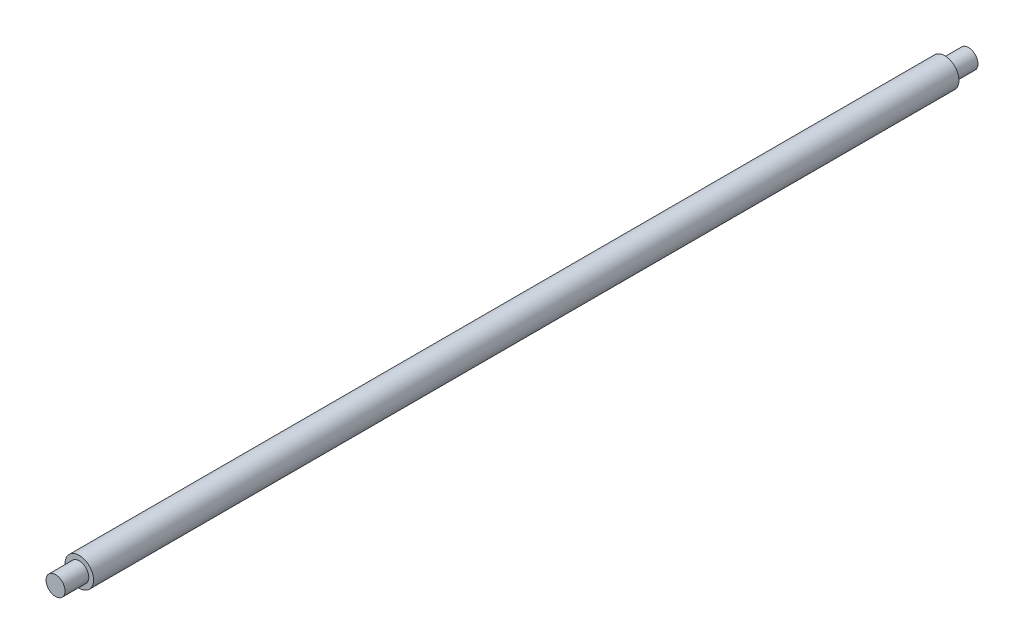
ISO-10303-21;
HEADER;
FILE_DESCRIPTION(('STEP AP214'),'2;1');
FILE_NAME('part.step','',(''),(''),'','','');
FILE_SCHEMA(('AUTOMOTIVE_DESIGN { 1 0 10303 214 1 1 1 1 }'));
ENDSEC;
DATA;
#1=APPLICATION_CONTEXT('core data for automotive mechanical design processes');
#2=APPLICATION_PROTOCOL_DEFINITION('international standard','automotive_design',2000,#1);
#3=PRODUCT_CONTEXT('',#1,'mechanical');
#4=PRODUCT('Part','Part','',(#3));
#5=PRODUCT_RELATED_PRODUCT_CATEGORY('part','',(#4));
#6=PRODUCT_DEFINITION_FORMATION('','',#4);
#7=PRODUCT_DEFINITION_CONTEXT('part definition',#1,'design');
#8=PRODUCT_DEFINITION('design','',#6,#7);
#9=PRODUCT_DEFINITION_SHAPE('','',#8);
#10=(LENGTH_UNIT() NAMED_UNIT(*) SI_UNIT(.MILLI.,.METRE.));
#11=(NAMED_UNIT(*) PLANE_ANGLE_UNIT() SI_UNIT($,.RADIAN.));
#12=(NAMED_UNIT(*) SI_UNIT($,.STERADIAN.) SOLID_ANGLE_UNIT());
#13=UNCERTAINTY_MEASURE_WITH_UNIT(LENGTH_MEASURE(1.E-05),#10,'distance_accuracy_value','');
#14=(GEOMETRIC_REPRESENTATION_CONTEXT(3) GLOBAL_UNCERTAINTY_ASSIGNED_CONTEXT((#13)) GLOBAL_UNIT_ASSIGNED_CONTEXT((#10,
#11,#12)) REPRESENTATION_CONTEXT('',''));
#15=CARTESIAN_POINT('',(0.,0.,0.));
#16=DIRECTION('',(0.,0.,1.));
#17=DIRECTION('',(1.,0.,0.));
#18=AXIS2_PLACEMENT_3D('',#15,#16,#17);
#19=CARTESIAN_POINT('',(0.,0.,-30.6605122421237));
#20=DIRECTION('',(0.,0.,1.));
#21=DIRECTION('',(1.,0.,0.));
#22=AXIS2_PLACEMENT_3D('',#19,#20,#21);
#23=CYLINDRICAL_SURFACE('',#22,6.35);
#24=CARTESIAN_POINT('',(0.,0.,-12.6999999999854));
#25=DIRECTION('',(0.,0.,1.));
#26=DIRECTION('',(0.,-1.,0.));
#27=AXIS2_PLACEMENT_3D('',#24,#25,#26);
#28=CIRCLE('',#27,6.35);
#29=CARTESIAN_POINT('',(0.,-6.35,-12.6999999999853));
#30=VERTEX_POINT('',#29);
#31=EDGE_CURVE('E10',#30,#30,#28,.F.);
#32=ORIENTED_EDGE('',*,*,#31,.F.);
#33=EDGE_LOOP('',(#32));
#34=FACE_BOUND('',#33,.T.);
#35=CARTESIAN_POINT('',(0.,0.,3.17500000001462));
#36=DIRECTION('',(0.,0.,1.));
#37=DIRECTION('',(1.,0.,0.));
#38=AXIS2_PLACEMENT_3D('',#35,#36,#37);
#39=CIRCLE('',#38,6.35);
#40=CARTESIAN_POINT('',(6.35,0.,3.17500000001462));
#41=VERTEX_POINT('',#40);
#42=EDGE_CURVE('E33',#41,#41,#39,.F.);
#43=ORIENTED_EDGE('',*,*,#42,.T.);
#44=EDGE_LOOP('',(#43));
#45=FACE_BOUND('',#44,.T.);
#46=ADVANCED_FACE('F30',(#34,#45),#23,.T.);
#47=CARTESIAN_POINT('',(721.565698213228,1652.75920881917,-12.6999999999979));
#48=DIRECTION('',(0.,0.,1.));
#49=DIRECTION('',(-0.917417497646003,0.397926042139675,0.));
#50=AXIS2_PLACEMENT_3D('',#47,#48,#49);
#51=PLANE('',#50);
#52=ORIENTED_EDGE('',*,*,#31,.T.);
#53=EDGE_LOOP('',(#52));
#54=FACE_BOUND('',#53,.T.);
#55=ADVANCED_FACE('F62',(#54),#51,.F.);
#56=CARTESIAN_POINT('',(0.,0.,3.17500000001462));
#57=DIRECTION('',(0.,0.,1.));
#58=DIRECTION('',(1.,0.,0.));
#59=AXIS2_PLACEMENT_3D('',#56,#57,#58);
#60=PLANE('',#59);
#61=ORIENTED_EDGE('',*,*,#42,.F.);
#62=EDGE_LOOP('',(#61));
#63=FACE_BOUND('',#62,.T.);
#64=CARTESIAN_POINT('',(0.,0.,3.17500000001462));
#65=DIRECTION('',(0.,0.,1.));
#66=DIRECTION('',(1.,0.,0.));
#67=AXIS2_PLACEMENT_3D('',#64,#65,#66);
#68=CIRCLE('',#67,9.52500000000178);
#69=CARTESIAN_POINT('',(9.52500000000178,0.,3.17500000001462));
#70=VERTEX_POINT('',#69);
#71=EDGE_CURVE('E51',#70,#70,#68,.T.);
#72=ORIENTED_EDGE('',*,*,#71,.F.);
#73=EDGE_LOOP('',(#72));
#74=FACE_BOUND('',#73,.T.);
#75=ADVANCED_FACE('F60',(#63,#74),#60,.F.);
#76=CARTESIAN_POINT('',(0.,0.,607.965768363213));
#77=DIRECTION('',(0.,0.,-1.));
#78=DIRECTION('',(-1.,0.,0.));
#79=AXIS2_PLACEMENT_3D('',#76,#77,#78);
#80=CYLINDRICAL_SURFACE('',#79,9.52500000000178);
#81=CARTESIAN_POINT('',(0.,0.,581.025));
#82=DIRECTION('',(0.,0.,-1.));
#83=DIRECTION('',(-1.,0.,0.));
#84=AXIS2_PLACEMENT_3D('',#81,#82,#83);
#85=CIRCLE('',#84,9.52500000000178);
#86=CARTESIAN_POINT('',(-9.52500000000178,0.,581.025));
#87=VERTEX_POINT('',#86);
#88=EDGE_CURVE('E46',#87,#87,#85,.T.);
#89=ORIENTED_EDGE('',*,*,#88,.T.);
#90=EDGE_LOOP('',(#89));
#91=FACE_BOUND('',#90,.T.);
#92=ORIENTED_EDGE('',*,*,#71,.T.);
#93=EDGE_LOOP('',(#92));
#94=FACE_BOUND('',#93,.T.);
#95=ADVANCED_FACE('F58',(#91,#94),#80,.T.);
#96=CARTESIAN_POINT('',(1.85708870520931E-13,-1.23669667350208E-13,581.025));
#97=DIRECTION('',(0.,0.,-1.));
#98=DIRECTION('',(-1.,0.,0.));
#99=AXIS2_PLACEMENT_3D('',#96,#97,#98);
#100=PLANE('',#99);
#101=CARTESIAN_POINT('',(0.,0.,581.025));
#102=DIRECTION('',(0.,0.,-1.));
#103=DIRECTION('',(-1.,0.,0.));
#104=AXIS2_PLACEMENT_3D('',#101,#102,#103);
#105=CIRCLE('',#104,6.35);
#106=CARTESIAN_POINT('',(-6.35,0.,581.025));
#107=VERTEX_POINT('',#106);
#108=EDGE_CURVE('E44',#107,#107,#105,.F.);
#109=ORIENTED_EDGE('',*,*,#108,.F.);
#110=EDGE_LOOP('',(#109));
#111=FACE_BOUND('',#110,.T.);
#112=ORIENTED_EDGE('',*,*,#88,.F.);
#113=EDGE_LOOP('',(#112));
#114=FACE_BOUND('',#113,.T.);
#115=ADVANCED_FACE('F69',(#111,#114),#100,.F.);
#116=CARTESIAN_POINT('',(-6.16144765180959,-25.0139108758453,596.9));
#117=DIRECTION('',(0.,0.,-1.));
#118=DIRECTION('',(-0.917417497646003,0.397926042139675,0.));
#119=AXIS2_PLACEMENT_3D('',#116,#117,#118);
#120=PLANE('',#119);
#121=CARTESIAN_POINT('',(0.,0.,596.9));
#122=DIRECTION('',(0.,0.,-1.));
#123=DIRECTION('',(-1.,0.,0.));
#124=AXIS2_PLACEMENT_3D('',#121,#122,#123);
#125=CIRCLE('',#124,6.35);
#126=CARTESIAN_POINT('',(-6.35,0.,596.9));
#127=VERTEX_POINT('',#126);
#128=EDGE_CURVE('E37',#127,#127,#125,.T.);
#129=ORIENTED_EDGE('',*,*,#128,.F.);
#130=EDGE_LOOP('',(#129));
#131=FACE_BOUND('',#130,.T.);
#132=ADVANCED_FACE('F80',(#131),#120,.F.);
#133=ORIENTED_EDGE('',*,*,#128,.T.);
#134=EDGE_LOOP('',(#133));
#135=FACE_BOUND('',#134,.T.);
#136=ORIENTED_EDGE('',*,*,#108,.T.);
#137=EDGE_LOOP('',(#136));
#138=FACE_BOUND('',#137,.T.);
#139=ADVANCED_FACE('F75',(#135,#138),#23,.T.);
#140=CLOSED_SHELL('',(#46,#55,#75,#95,#115,#132,#139));
#141=MANIFOLD_SOLID_BREP('B2',#140);
#142=ADVANCED_BREP_SHAPE_REPRESENTATION('',(#18,#141),#14);
#143=SHAPE_DEFINITION_REPRESENTATION(#9,#142);
ENDSEC;
END-ISO-10303-21;
